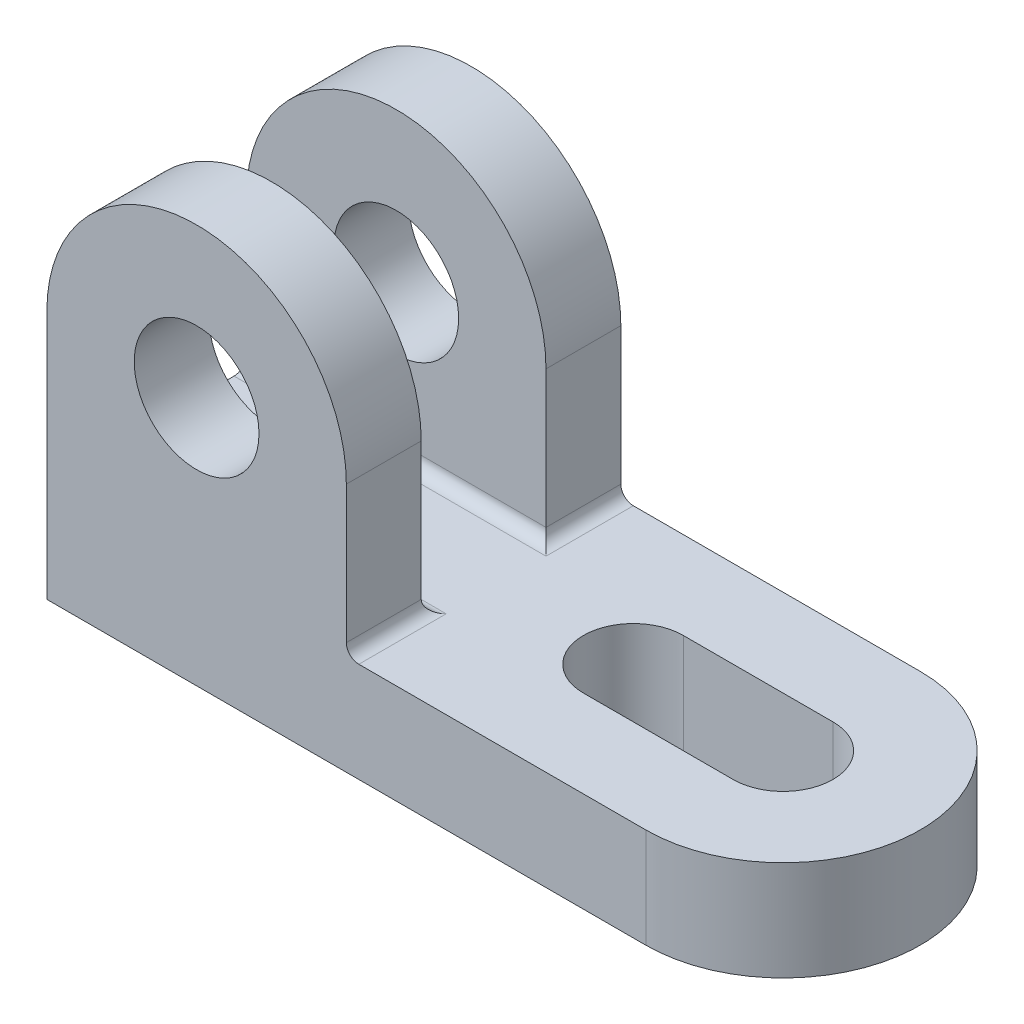
ISO-10303-21;
HEADER;
FILE_DESCRIPTION(('STEP AP214'),'2;1');
FILE_NAME('part.step','',(''),(''),'','','');
FILE_SCHEMA(('AUTOMOTIVE_DESIGN { 1 0 10303 214 1 1 1 1 }'));
ENDSEC;
DATA;
#1=APPLICATION_CONTEXT('core data for automotive mechanical design processes');
#2=APPLICATION_PROTOCOL_DEFINITION('international standard','automotive_design',2000,#1);
#3=PRODUCT_CONTEXT('',#1,'mechanical');
#4=PRODUCT('Part','Part','',(#3));
#5=PRODUCT_RELATED_PRODUCT_CATEGORY('part','',(#4));
#6=PRODUCT_DEFINITION_FORMATION('','',#4);
#7=PRODUCT_DEFINITION_CONTEXT('part definition',#1,'design');
#8=PRODUCT_DEFINITION('design','',#6,#7);
#9=PRODUCT_DEFINITION_SHAPE('','',#8);
#10=(LENGTH_UNIT() NAMED_UNIT(*) SI_UNIT(.MILLI.,.METRE.));
#11=(NAMED_UNIT(*) PLANE_ANGLE_UNIT() SI_UNIT($,.RADIAN.));
#12=(NAMED_UNIT(*) SI_UNIT($,.STERADIAN.) SOLID_ANGLE_UNIT());
#13=UNCERTAINTY_MEASURE_WITH_UNIT(LENGTH_MEASURE(1.E-05),#10,'distance_accuracy_value','');
#14=(GEOMETRIC_REPRESENTATION_CONTEXT(3) GLOBAL_UNCERTAINTY_ASSIGNED_CONTEXT((#13)) GLOBAL_UNIT_ASSIGNED_CONTEXT((#10,
#11,#12)) REPRESENTATION_CONTEXT('',''));
#15=CARTESIAN_POINT('',(0.,0.,0.));
#16=DIRECTION('',(0.,0.,1.));
#17=DIRECTION('',(1.,0.,0.));
#18=AXIS2_PLACEMENT_3D('',#15,#16,#17);
#19=CARTESIAN_POINT('',(37.,16.,0.));
#20=DIRECTION('',(0.,1.,0.));
#21=DIRECTION('',(0.,0.,1.));
#22=AXIS2_PLACEMENT_3D('',#19,#20,#21);
#23=PLANE('',#22);
#24=CARTESIAN_POINT('',(37.,16.,0.));
#25=DIRECTION('',(0.,1.,0.));
#26=DIRECTION('',(0.,0.,1.));
#27=AXIS2_PLACEMENT_3D('',#24,#25,#26);
#28=CIRCLE('',#27,8.00000000000001);
#29=CARTESIAN_POINT('',(37.,16.,8.00000000000001));
#30=VERTEX_POINT('',#29);
#31=CARTESIAN_POINT('',(37.,16.,-8.00000000000001));
#32=VERTEX_POINT('',#31);
#33=EDGE_CURVE('E213',#30,#32,#28,.T.);
#34=ORIENTED_EDGE('',*,*,#33,.F.);
#35=DIRECTION('',(1.,0.,0.));
#36=VECTOR('',#35,1.);
#37=CARTESIAN_POINT('',(37.,16.,8.00000000000001));
#38=LINE('',#37,#36);
#39=CARTESIAN_POINT('',(13.,16.,8.00000000000001));
#40=VERTEX_POINT('',#39);
#41=EDGE_CURVE('E220',#40,#30,#38,.T.);
#42=ORIENTED_EDGE('',*,*,#41,.F.);
#43=CARTESIAN_POINT('',(13.,16.,0.));
#44=DIRECTION('',(0.,1.,0.));
#45=DIRECTION('',(0.,0.,1.));
#46=AXIS2_PLACEMENT_3D('',#43,#44,#45);
#47=CIRCLE('',#46,8.00000000000001);
#48=CARTESIAN_POINT('',(13.,16.,-8.));
#49=VERTEX_POINT('',#48);
#50=EDGE_CURVE('E234',#49,#40,#47,.T.);
#51=ORIENTED_EDGE('',*,*,#50,.F.);
#52=DIRECTION('',(-1.,0.,0.));
#53=VECTOR('',#52,1.);
#54=CARTESIAN_POINT('',(37.,16.,-8.00000000000001));
#55=LINE('',#54,#53);
#56=EDGE_CURVE('E231',#32,#49,#55,.T.);
#57=ORIENTED_EDGE('',*,*,#56,.F.);
#58=EDGE_LOOP('',(#34,#42,#51,#57));
#59=FACE_BOUND('',#58,.T.);
#60=DIRECTION('',(-1.,0.,0.));
#61=VECTOR('',#60,1.);
#62=CARTESIAN_POINT('',(37.,16.,8.00000000000001));
#63=LINE('',#62,#61);
#64=CARTESIAN_POINT('',(-59.,16.,8.00000000000001));
#65=VERTEX_POINT('',#64);
#66=CARTESIAN_POINT('',(-8.99999999999999,16.,8.00000000000001));
#67=VERTEX_POINT('',#66);
#68=EDGE_CURVE('E282',#65,#67,#63,.F.);
#69=ORIENTED_EDGE('',*,*,#68,.T.);
#70=DIRECTION('',(0.,0.,1.));
#71=VECTOR('',#70,1.);
#72=CARTESIAN_POINT('',(-8.99999999999999,16.,22.));
#73=LINE('',#72,#71);
#74=CARTESIAN_POINT('',(-8.99999999999999,16.,22.));
#75=VERTEX_POINT('',#74);
#76=EDGE_CURVE('E284',#67,#75,#73,.T.);
#77=ORIENTED_EDGE('',*,*,#76,.T.);
#78=DIRECTION('',(1.,0.,0.));
#79=VECTOR('',#78,1.);
#80=CARTESIAN_POINT('',(-59.,16.,22.));
#81=LINE('',#80,#79);
#82=CARTESIAN_POINT('',(37.,16.,22.));
#83=VERTEX_POINT('',#82);
#84=EDGE_CURVE('E248',#75,#83,#81,.T.);
#85=ORIENTED_EDGE('',*,*,#84,.T.);
#86=CARTESIAN_POINT('',(37.,16.,0.));
#87=DIRECTION('',(0.,1.,0.));
#88=DIRECTION('',(0.,0.,1.));
#89=AXIS2_PLACEMENT_3D('',#86,#87,#88);
#90=CIRCLE('',#89,22.);
#91=CARTESIAN_POINT('',(37.,16.,-22.));
#92=VERTEX_POINT('',#91);
#93=EDGE_CURVE('E250',#83,#92,#90,.T.);
#94=ORIENTED_EDGE('',*,*,#93,.T.);
#95=DIRECTION('',(1.,0.,0.));
#96=VECTOR('',#95,1.);
#97=CARTESIAN_POINT('',(-59.,16.,-22.));
#98=LINE('',#97,#96);
#99=CARTESIAN_POINT('',(-8.99999999999999,16.,-22.));
#100=VERTEX_POINT('',#99);
#101=EDGE_CURVE('E254',#100,#92,#98,.T.);
#102=ORIENTED_EDGE('',*,*,#101,.F.);
#103=DIRECTION('',(0.,0.,-1.));
#104=VECTOR('',#103,1.);
#105=CARTESIAN_POINT('',(-8.99999999999999,16.,0.));
#106=LINE('',#105,#104);
#107=CARTESIAN_POINT('',(-8.99999999999999,16.,-8.00000000000001));
#108=VERTEX_POINT('',#107);
#109=EDGE_CURVE('E280',#100,#108,#106,.F.);
#110=ORIENTED_EDGE('',*,*,#109,.T.);
#111=DIRECTION('',(-1.,0.,0.));
#112=VECTOR('',#111,1.);
#113=CARTESIAN_POINT('',(37.,16.,-8.00000000000001));
#114=LINE('',#113,#112);
#115=CARTESIAN_POINT('',(-59.,16.,-8.00000000000001));
#116=VERTEX_POINT('',#115);
#117=EDGE_CURVE('E278',#108,#116,#114,.T.);
#118=ORIENTED_EDGE('',*,*,#117,.T.);
#119=DIRECTION('',(0.,0.,1.));
#120=VECTOR('',#119,1.);
#121=CARTESIAN_POINT('',(-59.,16.,-22.));
#122=LINE('',#121,#120);
#123=EDGE_CURVE('E256',#116,#65,#122,.T.);
#124=ORIENTED_EDGE('',*,*,#123,.T.);
#125=EDGE_LOOP('',(#69,#77,#85,#94,#102,#110,#118,#124));
#126=FACE_BOUND('',#125,.T.);
#127=ADVANCED_FACE('F35',(#59,#126),#23,.T.);
#128=CARTESIAN_POINT('',(-59.,16.,22.));
#129=DIRECTION('',(0.,0.,-1.));
#130=DIRECTION('',(-1.,0.,0.));
#131=AXIS2_PLACEMENT_3D('',#128,#129,#130);
#132=PLANE('',#131);
#133=DIRECTION('',(1.,0.,0.));
#134=VECTOR('',#133,1.);
#135=CARTESIAN_POINT('',(-59.,0.,22.));
#136=LINE('',#135,#134);
#137=CARTESIAN_POINT('',(-59.,0.,22.));
#138=VERTEX_POINT('',#137);
#139=CARTESIAN_POINT('',(37.,0.,22.));
#140=VERTEX_POINT('',#139);
#141=EDGE_CURVE('E241',#138,#140,#136,.T.);
#142=ORIENTED_EDGE('',*,*,#141,.T.);
#143=DIRECTION('',(0.,-1.,0.));
#144=VECTOR('',#143,1.);
#145=CARTESIAN_POINT('',(37.,16.,22.));
#146=LINE('',#145,#144);
#147=EDGE_CURVE('E275',#83,#140,#146,.T.);
#148=ORIENTED_EDGE('',*,*,#147,.F.);
#149=ORIENTED_EDGE('',*,*,#84,.F.);
#150=CARTESIAN_POINT('',(-8.99999999999999,18.,22.));
#151=DIRECTION('',(0.,0.,-1.));
#152=DIRECTION('',(-1.,0.,0.));
#153=AXIS2_PLACEMENT_3D('',#150,#151,#152);
#154=CIRCLE('',#153,2.);
#155=CARTESIAN_POINT('',(-11.,18.,22.));
#156=VERTEX_POINT('',#155);
#157=EDGE_CURVE('E294',#75,#156,#154,.T.);
#158=ORIENTED_EDGE('',*,*,#157,.T.);
#159=DIRECTION('',(0.,1.,0.));
#160=VECTOR('',#159,1.);
#161=CARTESIAN_POINT('',(-11.,0.,22.));
#162=LINE('',#161,#160);
#163=CARTESIAN_POINT('',(-11.,40.,22.));
#164=VERTEX_POINT('',#163);
#165=EDGE_CURVE('E206',#156,#164,#162,.T.);
#166=ORIENTED_EDGE('',*,*,#165,.T.);
#167=CARTESIAN_POINT('',(-35.,40.,22.));
#168=DIRECTION('',(0.,0.,1.));
#169=DIRECTION('',(1.,0.,0.));
#170=AXIS2_PLACEMENT_3D('',#167,#168,#169);
#171=CIRCLE('',#170,24.);
#172=CARTESIAN_POINT('',(-59.,40.,22.));
#173=VERTEX_POINT('',#172);
#174=EDGE_CURVE('E190',#164,#173,#171,.T.);
#175=ORIENTED_EDGE('',*,*,#174,.T.);
#176=DIRECTION('',(0.,-1.,0.));
#177=VECTOR('',#176,1.);
#178=CARTESIAN_POINT('',(-59.,16.,22.));
#179=LINE('',#178,#177);
#180=EDGE_CURVE('E259',#173,#138,#179,.T.);
#181=ORIENTED_EDGE('',*,*,#180,.T.);
#182=EDGE_LOOP('',(#142,#148,#149,#158,#166,#175,#181));
#183=FACE_BOUND('',#182,.T.);
#184=CARTESIAN_POINT('',(-35.,40.,22.));
#185=DIRECTION('',(0.,0.,1.));
#186=DIRECTION('',(1.,0.,0.));
#187=AXIS2_PLACEMENT_3D('',#184,#185,#186);
#188=CIRCLE('',#187,10.);
#189=CARTESIAN_POINT('',(-25.,40.,22.));
#190=VERTEX_POINT('',#189);
#191=EDGE_CURVE('E196',#190,#190,#188,.T.);
#192=ORIENTED_EDGE('',*,*,#191,.F.);
#193=EDGE_LOOP('',(#192));
#194=FACE_BOUND('',#193,.T.);
#195=ADVANCED_FACE('F324',(#183,#194),#132,.F.);
#196=CARTESIAN_POINT('',(37.,16.,0.));
#197=DIRECTION('',(0.,-1.,0.));
#198=DIRECTION('',(0.,0.,-1.));
#199=AXIS2_PLACEMENT_3D('',#196,#197,#198);
#200=CYLINDRICAL_SURFACE('',#199,22.);
#201=CARTESIAN_POINT('',(37.,0.,0.));
#202=DIRECTION('',(0.,1.,0.));
#203=DIRECTION('',(0.,0.,1.));
#204=AXIS2_PLACEMENT_3D('',#201,#202,#203);
#205=CIRCLE('',#204,22.);
#206=CARTESIAN_POINT('',(37.,0.,-22.));
#207=VERTEX_POINT('',#206);
#208=EDGE_CURVE('E262',#140,#207,#205,.T.);
#209=ORIENTED_EDGE('',*,*,#208,.T.);
#210=DIRECTION('',(0.,-1.,0.));
#211=VECTOR('',#210,1.);
#212=CARTESIAN_POINT('',(37.,16.,-22.));
#213=LINE('',#212,#211);
#214=EDGE_CURVE('E273',#92,#207,#213,.T.);
#215=ORIENTED_EDGE('',*,*,#214,.F.);
#216=ORIENTED_EDGE('',*,*,#93,.F.);
#217=ORIENTED_EDGE('',*,*,#147,.T.);
#218=EDGE_LOOP('',(#209,#215,#216,#217));
#219=FACE_BOUND('',#218,.T.);
#220=ADVANCED_FACE('F329',(#219),#200,.T.);
#221=CARTESIAN_POINT('',(-59.,16.,-22.));
#222=DIRECTION('',(0.,0.,-1.));
#223=DIRECTION('',(-1.,0.,0.));
#224=AXIS2_PLACEMENT_3D('',#221,#222,#223);
#225=PLANE('',#224);
#226=DIRECTION('',(1.,0.,0.));
#227=VECTOR('',#226,1.);
#228=CARTESIAN_POINT('',(-59.,0.,-22.));
#229=LINE('',#228,#227);
#230=CARTESIAN_POINT('',(-59.,0.,-22.));
#231=VERTEX_POINT('',#230);
#232=EDGE_CURVE('E265',#231,#207,#229,.T.);
#233=ORIENTED_EDGE('',*,*,#232,.F.);
#234=DIRECTION('',(0.,-1.,0.));
#235=VECTOR('',#234,1.);
#236=CARTESIAN_POINT('',(-59.,16.,-22.));
#237=LINE('',#236,#235);
#238=CARTESIAN_POINT('',(-59.,40.,-22.));
#239=VERTEX_POINT('',#238);
#240=EDGE_CURVE('E271',#239,#231,#237,.T.);
#241=ORIENTED_EDGE('',*,*,#240,.F.);
#242=CARTESIAN_POINT('',(-35.,40.,-22.));
#243=DIRECTION('',(0.,0.,1.));
#244=DIRECTION('',(1.,0.,0.));
#245=AXIS2_PLACEMENT_3D('',#242,#243,#244);
#246=CIRCLE('',#245,24.);
#247=CARTESIAN_POINT('',(-11.,40.,-22.));
#248=VERTEX_POINT('',#247);
#249=EDGE_CURVE('E186',#248,#239,#246,.T.);
#250=ORIENTED_EDGE('',*,*,#249,.F.);
#251=DIRECTION('',(0.,1.,0.));
#252=VECTOR('',#251,1.);
#253=CARTESIAN_POINT('',(-11.,0.,-22.));
#254=LINE('',#253,#252);
#255=CARTESIAN_POINT('',(-11.,18.,-22.));
#256=VERTEX_POINT('',#255);
#257=EDGE_CURVE('E169',#256,#248,#254,.T.);
#258=ORIENTED_EDGE('',*,*,#257,.F.);
#259=CARTESIAN_POINT('',(-8.99999999999999,18.,-22.));
#260=DIRECTION('',(0.,0.,-1.));
#261=DIRECTION('',(-1.,0.,0.));
#262=AXIS2_PLACEMENT_3D('',#259,#260,#261);
#263=CIRCLE('',#262,2.);
#264=EDGE_CURVE('E44',#256,#100,#263,.F.);
#265=ORIENTED_EDGE('',*,*,#264,.T.);
#266=ORIENTED_EDGE('',*,*,#101,.T.);
#267=ORIENTED_EDGE('',*,*,#214,.T.);
#268=EDGE_LOOP('',(#233,#241,#250,#258,#265,#266,#267));
#269=FACE_BOUND('',#268,.T.);
#270=CARTESIAN_POINT('',(-35.,40.,-22.));
#271=DIRECTION('',(0.,0.,1.));
#272=DIRECTION('',(1.,0.,0.));
#273=AXIS2_PLACEMENT_3D('',#270,#271,#272);
#274=CIRCLE('',#273,10.);
#275=CARTESIAN_POINT('',(-25.,40.,-22.));
#276=VERTEX_POINT('',#275);
#277=EDGE_CURVE('E178',#276,#276,#274,.T.);
#278=ORIENTED_EDGE('',*,*,#277,.T.);
#279=EDGE_LOOP('',(#278));
#280=FACE_BOUND('',#279,.T.);
#281=ADVANCED_FACE('F333',(#269,#280),#225,.T.);
#282=CARTESIAN_POINT('',(-59.,16.,-22.));
#283=DIRECTION('',(1.,0.,0.));
#284=DIRECTION('',(0.,0.,-1.));
#285=AXIS2_PLACEMENT_3D('',#282,#283,#284);
#286=PLANE('',#285);
#287=DIRECTION('',(0.,0.,1.));
#288=VECTOR('',#287,1.);
#289=CARTESIAN_POINT('',(-59.,0.,-22.));
#290=LINE('',#289,#288);
#291=EDGE_CURVE('E251',#231,#138,#290,.T.);
#292=ORIENTED_EDGE('',*,*,#291,.T.);
#293=ORIENTED_EDGE('',*,*,#180,.F.);
#294=DIRECTION('',(0.,0.,1.));
#295=VECTOR('',#294,1.);
#296=CARTESIAN_POINT('',(-59.,40.,10.));
#297=LINE('',#296,#295);
#298=CARTESIAN_POINT('',(-59.,40.,10.));
#299=VERTEX_POINT('',#298);
#300=EDGE_CURVE('E203',#299,#173,#297,.T.);
#301=ORIENTED_EDGE('',*,*,#300,.F.);
#302=DIRECTION('',(0.,1.,0.));
#303=VECTOR('',#302,1.);
#304=CARTESIAN_POINT('',(-59.,0.,10.));
#305=LINE('',#304,#303);
#306=CARTESIAN_POINT('',(-59.,18.,10.));
#307=VERTEX_POINT('',#306);
#308=EDGE_CURVE('E195',#307,#299,#305,.T.);
#309=ORIENTED_EDGE('',*,*,#308,.F.);
#310=CARTESIAN_POINT('',(-59.,18.,8.00000000000001));
#311=DIRECTION('',(1.,0.,0.));
#312=DIRECTION('',(0.,0.,-1.));
#313=AXIS2_PLACEMENT_3D('',#310,#311,#312);
#314=CIRCLE('',#313,2.);
#315=EDGE_CURVE('E296',#307,#65,#314,.T.);
#316=ORIENTED_EDGE('',*,*,#315,.T.);
#317=ORIENTED_EDGE('',*,*,#123,.F.);
#318=CARTESIAN_POINT('',(-59.,18.,-8.00000000000001));
#319=DIRECTION('',(1.,0.,0.));
#320=DIRECTION('',(0.,0.,-1.));
#321=AXIS2_PLACEMENT_3D('',#318,#319,#320);
#322=CIRCLE('',#321,2.);
#323=CARTESIAN_POINT('',(-59.,18.,-10.));
#324=VERTEX_POINT('',#323);
#325=EDGE_CURVE('E11',#116,#324,#322,.T.);
#326=ORIENTED_EDGE('',*,*,#325,.T.);
#327=DIRECTION('',(0.,1.,0.));
#328=VECTOR('',#327,1.);
#329=CARTESIAN_POINT('',(-59.,0.,-10.));
#330=LINE('',#329,#328);
#331=CARTESIAN_POINT('',(-59.,40.,-10.));
#332=VERTEX_POINT('',#331);
#333=EDGE_CURVE('E163',#324,#332,#330,.T.);
#334=ORIENTED_EDGE('',*,*,#333,.T.);
#335=DIRECTION('',(0.,0.,-1.));
#336=VECTOR('',#335,1.);
#337=CARTESIAN_POINT('',(-59.,40.,-10.));
#338=LINE('',#337,#336);
#339=EDGE_CURVE('E173',#332,#239,#338,.T.);
#340=ORIENTED_EDGE('',*,*,#339,.T.);
#341=ORIENTED_EDGE('',*,*,#240,.T.);
#342=EDGE_LOOP('',(#292,#293,#301,#309,#316,#317,#326,#334,#340,#341));
#343=FACE_BOUND('',#342,.T.);
#344=ADVANCED_FACE('F313',(#343),#286,.F.);
#345=CARTESIAN_POINT('',(37.,0.,0.));
#346=DIRECTION('',(0.,1.,0.));
#347=DIRECTION('',(0.,0.,1.));
#348=AXIS2_PLACEMENT_3D('',#345,#346,#347);
#349=PLANE('',#348);
#350=DIRECTION('',(1.,0.,0.));
#351=VECTOR('',#350,1.);
#352=CARTESIAN_POINT('',(37.,0.,8.00000000000001));
#353=LINE('',#352,#351);
#354=CARTESIAN_POINT('',(13.,0.,8.00000000000001));
#355=VERTEX_POINT('',#354);
#356=CARTESIAN_POINT('',(37.,0.,8.00000000000001));
#357=VERTEX_POINT('',#356);
#358=EDGE_CURVE('E226',#355,#357,#353,.T.);
#359=ORIENTED_EDGE('',*,*,#358,.T.);
#360=CARTESIAN_POINT('',(37.,0.,0.));
#361=DIRECTION('',(0.,1.,0.));
#362=DIRECTION('',(0.,0.,1.));
#363=AXIS2_PLACEMENT_3D('',#360,#361,#362);
#364=CIRCLE('',#363,8.00000000000001);
#365=CARTESIAN_POINT('',(37.,0.,-8.00000000000001));
#366=VERTEX_POINT('',#365);
#367=EDGE_CURVE('E216',#357,#366,#364,.T.);
#368=ORIENTED_EDGE('',*,*,#367,.T.);
#369=DIRECTION('',(-1.,0.,0.));
#370=VECTOR('',#369,1.);
#371=CARTESIAN_POINT('',(37.,0.,-8.00000000000001));
#372=LINE('',#371,#370);
#373=CARTESIAN_POINT('',(13.,0.,-8.));
#374=VERTEX_POINT('',#373);
#375=EDGE_CURVE('E219',#366,#374,#372,.T.);
#376=ORIENTED_EDGE('',*,*,#375,.T.);
#377=CARTESIAN_POINT('',(13.,0.,0.));
#378=DIRECTION('',(0.,1.,0.));
#379=DIRECTION('',(0.,0.,1.));
#380=AXIS2_PLACEMENT_3D('',#377,#378,#379);
#381=CIRCLE('',#380,8.00000000000001);
#382=EDGE_CURVE('E223',#374,#355,#381,.T.);
#383=ORIENTED_EDGE('',*,*,#382,.T.);
#384=EDGE_LOOP('',(#359,#368,#376,#383));
#385=FACE_BOUND('',#384,.T.);
#386=ORIENTED_EDGE('',*,*,#141,.F.);
#387=ORIENTED_EDGE('',*,*,#291,.F.);
#388=ORIENTED_EDGE('',*,*,#232,.T.);
#389=ORIENTED_EDGE('',*,*,#208,.F.);
#390=EDGE_LOOP('',(#386,#387,#388,#389));
#391=FACE_BOUND('',#390,.T.);
#392=ADVANCED_FACE('F337',(#385,#391),#349,.F.);
#393=CARTESIAN_POINT('',(37.,0.,0.));
#394=DIRECTION('',(0.,1.,0.));
#395=DIRECTION('',(0.,0.,1.));
#396=AXIS2_PLACEMENT_3D('',#393,#394,#395);
#397=CYLINDRICAL_SURFACE('',#396,8.00000000000001);
#398=ORIENTED_EDGE('',*,*,#33,.T.);
#399=DIRECTION('',(0.,1.,0.));
#400=VECTOR('',#399,1.);
#401=CARTESIAN_POINT('',(37.,0.,-8.00000000000001));
#402=LINE('',#401,#400);
#403=EDGE_CURVE('E229',#366,#32,#402,.T.);
#404=ORIENTED_EDGE('',*,*,#403,.F.);
#405=ORIENTED_EDGE('',*,*,#367,.F.);
#406=DIRECTION('',(0.,1.,0.));
#407=VECTOR('',#406,1.);
#408=CARTESIAN_POINT('',(37.,0.,8.00000000000001));
#409=LINE('',#408,#407);
#410=EDGE_CURVE('E239',#357,#30,#409,.T.);
#411=ORIENTED_EDGE('',*,*,#410,.T.);
#412=EDGE_LOOP('',(#398,#404,#405,#411));
#413=FACE_BOUND('',#412,.T.);
#414=ADVANCED_FACE('F339',(#413),#397,.F.);
#415=CARTESIAN_POINT('',(37.,0.,8.00000000000001));
#416=DIRECTION('',(0.,0.,1.));
#417=DIRECTION('',(1.,0.,0.));
#418=AXIS2_PLACEMENT_3D('',#415,#416,#417);
#419=PLANE('',#418);
#420=ORIENTED_EDGE('',*,*,#41,.T.);
#421=ORIENTED_EDGE('',*,*,#410,.F.);
#422=ORIENTED_EDGE('',*,*,#358,.F.);
#423=DIRECTION('',(0.,1.,0.));
#424=VECTOR('',#423,1.);
#425=CARTESIAN_POINT('',(13.,0.,8.00000000000001));
#426=LINE('',#425,#424);
#427=EDGE_CURVE('E242',#355,#40,#426,.T.);
#428=ORIENTED_EDGE('',*,*,#427,.T.);
#429=EDGE_LOOP('',(#420,#421,#422,#428));
#430=FACE_BOUND('',#429,.T.);
#431=ADVANCED_FACE('F346',(#430),#419,.F.);
#432=CARTESIAN_POINT('',(13.,0.,0.));
#433=DIRECTION('',(0.,1.,0.));
#434=DIRECTION('',(0.,0.,1.));
#435=AXIS2_PLACEMENT_3D('',#432,#433,#434);
#436=CYLINDRICAL_SURFACE('',#435,8.00000000000001);
#437=ORIENTED_EDGE('',*,*,#50,.T.);
#438=ORIENTED_EDGE('',*,*,#427,.F.);
#439=ORIENTED_EDGE('',*,*,#382,.F.);
#440=DIRECTION('',(0.,1.,0.));
#441=VECTOR('',#440,1.);
#442=CARTESIAN_POINT('',(13.,0.,-8.));
#443=LINE('',#442,#441);
#444=EDGE_CURVE('E244',#374,#49,#443,.T.);
#445=ORIENTED_EDGE('',*,*,#444,.T.);
#446=EDGE_LOOP('',(#437,#438,#439,#445));
#447=FACE_BOUND('',#446,.T.);
#448=ADVANCED_FACE('F363',(#447),#436,.F.);
#449=CARTESIAN_POINT('',(37.,0.,-8.00000000000001));
#450=DIRECTION('',(0.,0.,-1.));
#451=DIRECTION('',(-1.,0.,0.));
#452=AXIS2_PLACEMENT_3D('',#449,#450,#451);
#453=PLANE('',#452);
#454=ORIENTED_EDGE('',*,*,#56,.T.);
#455=ORIENTED_EDGE('',*,*,#444,.F.);
#456=ORIENTED_EDGE('',*,*,#375,.F.);
#457=ORIENTED_EDGE('',*,*,#403,.T.);
#458=EDGE_LOOP('',(#454,#455,#456,#457));
#459=FACE_BOUND('',#458,.T.);
#460=ADVANCED_FACE('F359',(#459),#453,.F.);
#461=CARTESIAN_POINT('',(-35.,40.,10.));
#462=DIRECTION('',(0.,0.,1.));
#463=DIRECTION('',(1.,0.,0.));
#464=AXIS2_PLACEMENT_3D('',#461,#462,#463);
#465=CYLINDRICAL_SURFACE('',#464,24.);
#466=ORIENTED_EDGE('',*,*,#174,.F.);
#467=DIRECTION('',(0.,0.,1.));
#468=VECTOR('',#467,1.);
#469=CARTESIAN_POINT('',(-11.,40.,10.));
#470=LINE('',#469,#468);
#471=CARTESIAN_POINT('',(-11.,40.,10.));
#472=VERTEX_POINT('',#471);
#473=EDGE_CURVE('E210',#472,#164,#470,.T.);
#474=ORIENTED_EDGE('',*,*,#473,.F.);
#475=CARTESIAN_POINT('',(-35.,40.,10.));
#476=DIRECTION('',(0.,0.,1.));
#477=DIRECTION('',(1.,0.,0.));
#478=AXIS2_PLACEMENT_3D('',#475,#476,#477);
#479=CIRCLE('',#478,24.);
#480=EDGE_CURVE('E192',#472,#299,#479,.T.);
#481=ORIENTED_EDGE('',*,*,#480,.T.);
#482=ORIENTED_EDGE('',*,*,#300,.T.);
#483=EDGE_LOOP('',(#466,#474,#481,#482));
#484=FACE_BOUND('',#483,.T.);
#485=ADVANCED_FACE('F362',(#484),#465,.T.);
#486=CARTESIAN_POINT('',(-11.,0.,10.));
#487=DIRECTION('',(1.,0.,0.));
#488=DIRECTION('',(0.,0.,-1.));
#489=AXIS2_PLACEMENT_3D('',#486,#487,#488);
#490=PLANE('',#489);
#491=ORIENTED_EDGE('',*,*,#165,.F.);
#492=DIRECTION('',(0.,0.,1.));
#493=VECTOR('',#492,1.);
#494=CARTESIAN_POINT('',(-11.,18.,10.));
#495=LINE('',#494,#493);
#496=CARTESIAN_POINT('',(-11.,18.,10.));
#497=VERTEX_POINT('',#496);
#498=EDGE_CURVE('E287',#156,#497,#495,.F.);
#499=ORIENTED_EDGE('',*,*,#498,.T.);
#500=DIRECTION('',(0.,1.,0.));
#501=VECTOR('',#500,1.);
#502=CARTESIAN_POINT('',(-11.,0.,10.));
#503=LINE('',#502,#501);
#504=EDGE_CURVE('E198',#497,#472,#503,.T.);
#505=ORIENTED_EDGE('',*,*,#504,.T.);
#506=ORIENTED_EDGE('',*,*,#473,.T.);
#507=EDGE_LOOP('',(#491,#499,#505,#506));
#508=FACE_BOUND('',#507,.T.);
#509=ADVANCED_FACE('F373',(#508),#490,.T.);
#510=CARTESIAN_POINT('',(-35.,40.,10.));
#511=DIRECTION('',(0.,0.,1.));
#512=DIRECTION('',(1.,0.,0.));
#513=AXIS2_PLACEMENT_3D('',#510,#511,#512);
#514=CYLINDRICAL_SURFACE('',#513,10.);
#515=CARTESIAN_POINT('',(-35.,40.,10.));
#516=DIRECTION('',(0.,0.,1.));
#517=DIRECTION('',(1.,0.,0.));
#518=AXIS2_PLACEMENT_3D('',#515,#516,#517);
#519=CIRCLE('',#518,10.);
#520=CARTESIAN_POINT('',(-25.,40.,10.));
#521=VERTEX_POINT('',#520);
#522=EDGE_CURVE('E200',#521,#521,#519,.T.);
#523=ORIENTED_EDGE('',*,*,#522,.F.);
#524=EDGE_LOOP('',(#523));
#525=FACE_BOUND('',#524,.T.);
#526=ORIENTED_EDGE('',*,*,#191,.T.);
#527=EDGE_LOOP('',(#526));
#528=FACE_BOUND('',#527,.T.);
#529=ADVANCED_FACE('F377',(#525,#528),#514,.F.);
#530=CARTESIAN_POINT('',(0.,0.,10.));
#531=DIRECTION('',(0.,0.,1.));
#532=DIRECTION('',(1.,0.,0.));
#533=AXIS2_PLACEMENT_3D('',#530,#531,#532);
#534=PLANE('',#533);
#535=ORIENTED_EDGE('',*,*,#504,.F.);
#536=DIRECTION('',(-1.,0.,0.));
#537=VECTOR('',#536,1.);
#538=CARTESIAN_POINT('',(0.,18.,10.));
#539=LINE('',#538,#537);
#540=EDGE_CURVE('E289',#497,#307,#539,.T.);
#541=ORIENTED_EDGE('',*,*,#540,.T.);
#542=ORIENTED_EDGE('',*,*,#308,.T.);
#543=ORIENTED_EDGE('',*,*,#480,.F.);
#544=EDGE_LOOP('',(#535,#541,#542,#543));
#545=FACE_BOUND('',#544,.T.);
#546=ORIENTED_EDGE('',*,*,#522,.T.);
#547=EDGE_LOOP('',(#546));
#548=FACE_BOUND('',#547,.T.);
#549=ADVANCED_FACE('F381',(#545,#548),#534,.F.);
#550=CARTESIAN_POINT('',(-35.,40.,-10.));
#551=DIRECTION('',(0.,0.,-1.));
#552=DIRECTION('',(-1.,0.,0.));
#553=AXIS2_PLACEMENT_3D('',#550,#551,#552);
#554=CYLINDRICAL_SURFACE('',#553,24.);
#555=ORIENTED_EDGE('',*,*,#249,.T.);
#556=ORIENTED_EDGE('',*,*,#339,.F.);
#557=CARTESIAN_POINT('',(-35.,40.,-10.));
#558=DIRECTION('',(0.,0.,1.));
#559=DIRECTION('',(1.,0.,0.));
#560=AXIS2_PLACEMENT_3D('',#557,#558,#559);
#561=CIRCLE('',#560,24.);
#562=CARTESIAN_POINT('',(-11.,40.,-10.));
#563=VERTEX_POINT('',#562);
#564=EDGE_CURVE('E158',#563,#332,#561,.T.);
#565=ORIENTED_EDGE('',*,*,#564,.F.);
#566=DIRECTION('',(0.,0.,-1.));
#567=VECTOR('',#566,1.);
#568=CARTESIAN_POINT('',(-11.,40.,-10.));
#569=LINE('',#568,#567);
#570=EDGE_CURVE('E166',#563,#248,#569,.T.);
#571=ORIENTED_EDGE('',*,*,#570,.T.);
#572=EDGE_LOOP('',(#555,#556,#565,#571));
#573=FACE_BOUND('',#572,.T.);
#574=ADVANCED_FACE('F176',(#573),#554,.T.);
#575=CARTESIAN_POINT('',(-11.,0.,-10.));
#576=DIRECTION('',(-1.,0.,0.));
#577=DIRECTION('',(0.,0.,1.));
#578=AXIS2_PLACEMENT_3D('',#575,#576,#577);
#579=PLANE('',#578);
#580=DIRECTION('',(0.,1.,0.));
#581=VECTOR('',#580,1.);
#582=CARTESIAN_POINT('',(-11.,0.,-10.));
#583=LINE('',#582,#581);
#584=CARTESIAN_POINT('',(-11.,18.,-10.));
#585=VERTEX_POINT('',#584);
#586=EDGE_CURVE('E153',#585,#563,#583,.T.);
#587=ORIENTED_EDGE('',*,*,#586,.F.);
#588=DIRECTION('',(0.,0.,-1.));
#589=VECTOR('',#588,1.);
#590=CARTESIAN_POINT('',(-11.,18.,-10.));
#591=LINE('',#590,#589);
#592=EDGE_CURVE('E291',#585,#256,#591,.T.);
#593=ORIENTED_EDGE('',*,*,#592,.T.);
#594=ORIENTED_EDGE('',*,*,#257,.T.);
#595=ORIENTED_EDGE('',*,*,#570,.F.);
#596=EDGE_LOOP('',(#587,#593,#594,#595));
#597=FACE_BOUND('',#596,.T.);
#598=ADVANCED_FACE('F167',(#597),#579,.F.);
#599=CARTESIAN_POINT('',(-35.,40.,-10.));
#600=DIRECTION('',(0.,0.,-1.));
#601=DIRECTION('',(-1.,0.,0.));
#602=AXIS2_PLACEMENT_3D('',#599,#600,#601);
#603=CYLINDRICAL_SURFACE('',#602,10.);
#604=CARTESIAN_POINT('',(-35.,40.,-10.));
#605=DIRECTION('',(0.,0.,1.));
#606=DIRECTION('',(1.,0.,0.));
#607=AXIS2_PLACEMENT_3D('',#604,#605,#606);
#608=CIRCLE('',#607,10.);
#609=CARTESIAN_POINT('',(-25.,40.,-10.));
#610=VERTEX_POINT('',#609);
#611=EDGE_CURVE('E174',#610,#610,#608,.T.);
#612=ORIENTED_EDGE('',*,*,#611,.T.);
#613=EDGE_LOOP('',(#612));
#614=FACE_BOUND('',#613,.T.);
#615=ORIENTED_EDGE('',*,*,#277,.F.);
#616=EDGE_LOOP('',(#615));
#617=FACE_BOUND('',#616,.T.);
#618=ADVANCED_FACE('F390',(#614,#617),#603,.F.);
#619=CARTESIAN_POINT('',(0.,0.,-10.));
#620=DIRECTION('',(0.,0.,-1.));
#621=DIRECTION('',(1.,0.,0.));
#622=AXIS2_PLACEMENT_3D('',#619,#620,#621);
#623=PLANE('',#622);
#624=ORIENTED_EDGE('',*,*,#333,.F.);
#625=DIRECTION('',(-1.,0.,0.));
#626=VECTOR('',#625,1.);
#627=CARTESIAN_POINT('',(0.,18.,-10.));
#628=LINE('',#627,#626);
#629=EDGE_CURVE('E57',#324,#585,#628,.F.);
#630=ORIENTED_EDGE('',*,*,#629,.T.);
#631=ORIENTED_EDGE('',*,*,#586,.T.);
#632=ORIENTED_EDGE('',*,*,#564,.T.);
#633=EDGE_LOOP('',(#624,#630,#631,#632));
#634=FACE_BOUND('',#633,.T.);
#635=ORIENTED_EDGE('',*,*,#611,.F.);
#636=EDGE_LOOP('',(#635));
#637=FACE_BOUND('',#636,.T.);
#638=ADVANCED_FACE('F155',(#634,#637),#623,.F.);
#639=CARTESIAN_POINT('',(0.,18.,8.00000000000001));
#640=DIRECTION('',(-1.,0.,0.));
#641=DIRECTION('',(0.,0.,1.));
#642=AXIS2_PLACEMENT_3D('',#639,#640,#641);
#643=CYLINDRICAL_SURFACE('',#642,2.);
#644=ORIENTED_EDGE('',*,*,#315,.F.);
#645=ORIENTED_EDGE('',*,*,#540,.F.);
#646=CARTESIAN_POINT('',(-8.99999999999999,18.,8.00000000000001));
#647=DIRECTION('',(-0.707106781186547,0.,-0.707106781186547));
#648=DIRECTION('',(-0.707106781186547,0.,0.707106781186547));
#649=AXIS2_PLACEMENT_3D('',#646,#647,#648);
#650=ELLIPSE('',#649,2.82842712474619,2.);
#651=EDGE_CURVE('E188',#67,#497,#650,.T.);
#652=ORIENTED_EDGE('',*,*,#651,.F.);
#653=ORIENTED_EDGE('',*,*,#68,.F.);
#654=EDGE_LOOP('',(#644,#645,#652,#653));
#655=FACE_BOUND('',#654,.T.);
#656=ADVANCED_FACE('F319',(#655),#643,.F.);
#657=CARTESIAN_POINT('',(-8.99999999999999,18.,0.));
#658=DIRECTION('',(0.,0.,-1.));
#659=DIRECTION('',(-1.,0.,0.));
#660=AXIS2_PLACEMENT_3D('',#657,#658,#659);
#661=CYLINDRICAL_SURFACE('',#660,2.);
#662=ORIENTED_EDGE('',*,*,#651,.T.);
#663=ORIENTED_EDGE('',*,*,#498,.F.);
#664=ORIENTED_EDGE('',*,*,#157,.F.);
#665=ORIENTED_EDGE('',*,*,#76,.F.);
#666=EDGE_LOOP('',(#662,#663,#664,#665));
#667=FACE_BOUND('',#666,.T.);
#668=ADVANCED_FACE('F398',(#667),#661,.F.);
#669=CARTESIAN_POINT('',(37.,18.,-8.00000000000001));
#670=DIRECTION('',(-1.,0.,0.));
#671=DIRECTION('',(0.,0.,1.));
#672=AXIS2_PLACEMENT_3D('',#669,#670,#671);
#673=CYLINDRICAL_SURFACE('',#672,2.);
#674=ORIENTED_EDGE('',*,*,#325,.F.);
#675=ORIENTED_EDGE('',*,*,#117,.F.);
#676=CARTESIAN_POINT('',(-8.99999999999999,18.,-8.00000000000001));
#677=DIRECTION('',(-0.707106781186547,0.,0.707106781186547));
#678=DIRECTION('',(-0.707106781186547,0.,-0.707106781186547));
#679=AXIS2_PLACEMENT_3D('',#676,#677,#678);
#680=ELLIPSE('',#679,2.82842712474619,2.);
#681=EDGE_CURVE('E39',#585,#108,#680,.T.);
#682=ORIENTED_EDGE('',*,*,#681,.F.);
#683=ORIENTED_EDGE('',*,*,#629,.F.);
#684=EDGE_LOOP('',(#674,#675,#682,#683));
#685=FACE_BOUND('',#684,.T.);
#686=ADVANCED_FACE('F37',(#685),#673,.F.);
#687=CARTESIAN_POINT('',(-8.99999999999999,18.,-10.));
#688=DIRECTION('',(0.,0.,-1.));
#689=DIRECTION('',(-1.,0.,0.));
#690=AXIS2_PLACEMENT_3D('',#687,#688,#689);
#691=CYLINDRICAL_SURFACE('',#690,2.);
#692=ORIENTED_EDGE('',*,*,#681,.T.);
#693=ORIENTED_EDGE('',*,*,#109,.F.);
#694=ORIENTED_EDGE('',*,*,#264,.F.);
#695=ORIENTED_EDGE('',*,*,#592,.F.);
#696=EDGE_LOOP('',(#692,#693,#694,#695));
#697=FACE_BOUND('',#696,.T.);
#698=ADVANCED_FACE('F307',(#697),#691,.F.);
#699=CLOSED_SHELL('',(#127,#195,#220,#281,#344,#392,#414,#431,#448,#460,#485,#509,#529,#549,
#574,#598,#618,#638,#656,#668,#686,#698));
#700=MANIFOLD_SOLID_BREP('B2',#699);
#701=ADVANCED_BREP_SHAPE_REPRESENTATION('',(#18,#700),#14);
#702=SHAPE_DEFINITION_REPRESENTATION(#9,#701);
ENDSEC;
END-ISO-10303-21;
